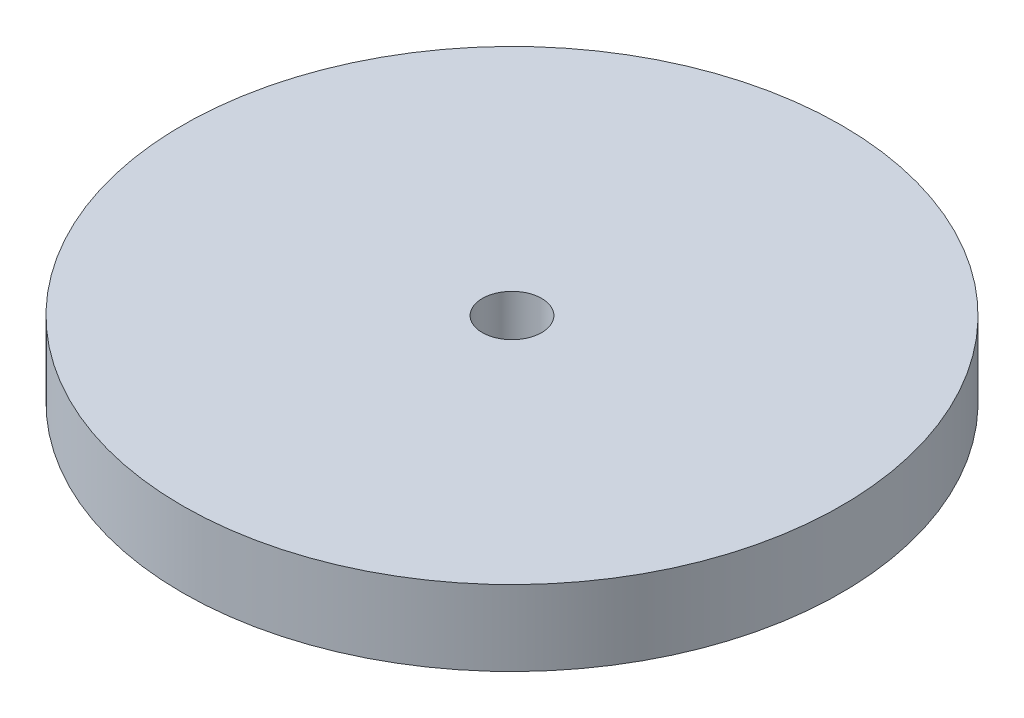
ISO-10303-21;
HEADER;
FILE_DESCRIPTION(('STEP AP214'),'2;1');
FILE_NAME('part.step','',(''),(''),'','','');
FILE_SCHEMA(('AUTOMOTIVE_DESIGN { 1 0 10303 214 1 1 1 1 }'));
ENDSEC;
DATA;
#1=APPLICATION_CONTEXT('core data for automotive mechanical design processes');
#2=APPLICATION_PROTOCOL_DEFINITION('international standard','automotive_design',2000,#1);
#3=PRODUCT_CONTEXT('',#1,'mechanical');
#4=PRODUCT('Part','Part','',(#3));
#5=PRODUCT_RELATED_PRODUCT_CATEGORY('part','',(#4));
#6=PRODUCT_DEFINITION_FORMATION('','',#4);
#7=PRODUCT_DEFINITION_CONTEXT('part definition',#1,'design');
#8=PRODUCT_DEFINITION('design','',#6,#7);
#9=PRODUCT_DEFINITION_SHAPE('','',#8);
#10=(LENGTH_UNIT() NAMED_UNIT(*) SI_UNIT(.MILLI.,.METRE.));
#11=(NAMED_UNIT(*) PLANE_ANGLE_UNIT() SI_UNIT($,.RADIAN.));
#12=(NAMED_UNIT(*) SI_UNIT($,.STERADIAN.) SOLID_ANGLE_UNIT());
#13=UNCERTAINTY_MEASURE_WITH_UNIT(LENGTH_MEASURE(1.E-05),#10,'distance_accuracy_value','');
#14=(GEOMETRIC_REPRESENTATION_CONTEXT(3) GLOBAL_UNCERTAINTY_ASSIGNED_CONTEXT((#13)) GLOBAL_UNIT_ASSIGNED_CONTEXT((#10,
#11,#12)) REPRESENTATION_CONTEXT('',''));
#15=CARTESIAN_POINT('',(0.,0.,0.));
#16=DIRECTION('',(0.,0.,1.));
#17=DIRECTION('',(1.,0.,0.));
#18=AXIS2_PLACEMENT_3D('',#15,#16,#17);
#19=CARTESIAN_POINT('',(0.,7.62,0.));
#20=DIRECTION('',(0.,-1.,0.));
#21=DIRECTION('',(0.,0.,-1.));
#22=AXIS2_PLACEMENT_3D('',#19,#20,#21);
#23=CYLINDRICAL_SURFACE('',#22,33.3375);
#24=CARTESIAN_POINT('',(0.,7.62,0.));
#25=DIRECTION('',(0.,1.,0.));
#26=DIRECTION('',(0.,0.,1.));
#27=AXIS2_PLACEMENT_3D('',#24,#25,#26);
#28=CIRCLE('',#27,33.3375);
#29=CARTESIAN_POINT('',(0.,7.62,-33.3375));
#30=VERTEX_POINT('',#29);
#31=EDGE_CURVE('E10',#30,#30,#28,.T.);
#32=CARTESIAN_POINT('',(0.,0.,0.));
#33=DIRECTION('',(0.,1.,0.));
#34=DIRECTION('',(0.,0.,1.));
#35=AXIS2_PLACEMENT_3D('',#32,#33,#34);
#36=CIRCLE('',#35,33.3375);
#37=CARTESIAN_POINT('',(0.,0.,-33.3375));
#38=VERTEX_POINT('',#37);
#39=EDGE_CURVE('E36',#38,#38,#36,.T.);
#40=CARTESIAN_POINT('',(0.,7.62,-33.3375));
#41=CARTESIAN_POINT('',(0.,7.540625,-33.3375));
#42=CARTESIAN_POINT('',(0.,7.46125,-33.3375));
#43=CARTESIAN_POINT('',(0.,7.3025,-33.3375));
#44=CARTESIAN_POINT('',(0.,7.223125,-33.3375));
#45=CARTESIAN_POINT('',(0.,7.064375,-33.3375));
#46=CARTESIAN_POINT('',(0.,6.985,-33.3375));
#47=CARTESIAN_POINT('',(0.,6.82625,-33.3375));
#48=CARTESIAN_POINT('',(0.,6.746875,-33.3375));
#49=CARTESIAN_POINT('',(0.,6.588125,-33.3375));
#50=CARTESIAN_POINT('',(0.,6.50875,-33.3375));
#51=CARTESIAN_POINT('',(0.,6.35,-33.3375));
#52=CARTESIAN_POINT('',(0.,6.270625,-33.3375));
#53=CARTESIAN_POINT('',(0.,6.111875,-33.3375));
#54=CARTESIAN_POINT('',(0.,6.0325,-33.3375));
#55=CARTESIAN_POINT('',(0.,5.87375,-33.3375));
#56=CARTESIAN_POINT('',(0.,5.794375,-33.3375));
#57=CARTESIAN_POINT('',(0.,5.635625,-33.3375));
#58=CARTESIAN_POINT('',(0.,5.55625,-33.3375));
#59=CARTESIAN_POINT('',(0.,5.3975,-33.3375));
#60=CARTESIAN_POINT('',(0.,5.318125,-33.3375));
#61=CARTESIAN_POINT('',(0.,5.159375,-33.3375));
#62=CARTESIAN_POINT('',(0.,5.08,-33.3375));
#63=CARTESIAN_POINT('',(0.,4.92125,-33.3375));
#64=CARTESIAN_POINT('',(0.,4.841875,-33.3375));
#65=CARTESIAN_POINT('',(0.,4.683125,-33.3375));
#66=CARTESIAN_POINT('',(0.,4.60375,-33.3375));
#67=CARTESIAN_POINT('',(0.,4.445,-33.3375));
#68=CARTESIAN_POINT('',(0.,4.365625,-33.3375));
#69=CARTESIAN_POINT('',(0.,4.206875,-33.3375));
#70=CARTESIAN_POINT('',(0.,4.1275,-33.3375));
#71=CARTESIAN_POINT('',(0.,3.96875,-33.3375));
#72=CARTESIAN_POINT('',(0.,3.889375,-33.3375));
#73=CARTESIAN_POINT('',(0.,3.730625,-33.3375));
#74=CARTESIAN_POINT('',(0.,3.65125,-33.3375));
#75=CARTESIAN_POINT('',(0.,3.4925,-33.3375));
#76=CARTESIAN_POINT('',(0.,3.413125,-33.3375));
#77=CARTESIAN_POINT('',(0.,3.254375,-33.3375));
#78=CARTESIAN_POINT('',(0.,3.175,-33.3375));
#79=CARTESIAN_POINT('',(0.,3.01625,-33.3375));
#80=CARTESIAN_POINT('',(0.,2.936875,-33.3375));
#81=CARTESIAN_POINT('',(0.,2.778125,-33.3375));
#82=CARTESIAN_POINT('',(0.,2.69875,-33.3375));
#83=CARTESIAN_POINT('',(0.,2.54,-33.3375));
#84=CARTESIAN_POINT('',(0.,2.460625,-33.3375));
#85=CARTESIAN_POINT('',(0.,2.301875,-33.3375));
#86=CARTESIAN_POINT('',(0.,2.2225,-33.3375));
#87=CARTESIAN_POINT('',(0.,2.06375,-33.3375));
#88=CARTESIAN_POINT('',(0.,1.984375,-33.3375));
#89=CARTESIAN_POINT('',(0.,1.825625,-33.3375));
#90=CARTESIAN_POINT('',(0.,1.74625,-33.3375));
#91=CARTESIAN_POINT('',(0.,1.5875,-33.3375));
#92=CARTESIAN_POINT('',(0.,1.508125,-33.3375));
#93=CARTESIAN_POINT('',(0.,1.349375,-33.3375));
#94=CARTESIAN_POINT('',(0.,1.27,-33.3375));
#95=CARTESIAN_POINT('',(0.,1.11125,-33.3375));
#96=CARTESIAN_POINT('',(0.,1.031875,-33.3375));
#97=CARTESIAN_POINT('',(0.,0.873125,-33.3375));
#98=CARTESIAN_POINT('',(0.,0.79375,-33.3375));
#99=CARTESIAN_POINT('',(0.,0.635,-33.3375));
#100=CARTESIAN_POINT('',(0.,0.555625,-33.3375));
#101=CARTESIAN_POINT('',(0.,0.396875,-33.3375));
#102=CARTESIAN_POINT('',(0.,0.3175,-33.3375));
#103=CARTESIAN_POINT('',(0.,0.15875,-33.3375));
#104=CARTESIAN_POINT('',(0.,0.0793749999999999,-33.3375));
#105=CARTESIAN_POINT('',(0.,0.,-33.3375));
#106=B_SPLINE_CURVE_WITH_KNOTS('',3,(#40,#41,#42,#43,#44,#45,#46,#47,#48,#49,#50,#51,#52,#53,
#54,#55,#56,#57,#58,#59,#60,#61,#62,#63,#64,#65,#66,#67,#68,#69,#70,#71,#72,#73,#74,#75,#76,#77,
#78,#79,#80,#81,#82,#83,#84,#85,#86,#87,#88,#89,#90,#91,#92,#93,#94,#95,#96,#97,#98,#99,#100,
#101,#102,#103,#104,#105),.UNSPECIFIED.,.F.,.F.,(4,2,2,2,2,2,2,2,2,2,2,2,2,2,2,2,2,2,2,2,2,2,2,
2,2,2,2,2,2,2,2,2,4),(0.,0.238125,0.476249999999999,0.714375,0.952499999999999,1.190625,1.42875,
1.666875,1.905,2.143125,2.38125,2.619375,2.8575,3.095625,3.33375,3.571875,3.81,4.048125,4.28625,
4.524375,4.7625,5.000625,5.23875,5.476875,5.715,5.953125,6.19125,6.429375,6.6675,6.905625,
7.14375,7.381875,7.62),.UNSPECIFIED.);
#107=EDGE_CURVE('BSEAM33',#30,#38,#106,.T.);
#108=ORIENTED_EDGE('',*,*,#31,.F.);
#109=ORIENTED_EDGE('',*,*,#39,.T.);
#110=ORIENTED_EDGE('',*,*,#107,.T.);
#111=ORIENTED_EDGE('',*,*,#107,.F.);
#112=EDGE_LOOP('',(#108,#110,#109,#111));
#113=FACE_BOUND('',#112,.T.);
#114=ADVANCED_FACE('F33',(#113),#23,.T.);
#115=CARTESIAN_POINT('',(0.,7.62,0.));
#116=DIRECTION('',(0.,1.,0.));
#117=DIRECTION('',(0.,0.,1.));
#118=AXIS2_PLACEMENT_3D('',#115,#116,#117);
#119=PLANE('',#118);
#120=CARTESIAN_POINT('',(0.,7.62,0.));
#121=DIRECTION('',(0.,1.,0.));
#122=DIRECTION('',(0.,0.,1.));
#123=AXIS2_PLACEMENT_3D('',#120,#121,#122);
#124=CIRCLE('',#123,3.);
#125=CARTESIAN_POINT('',(0.,7.62,3.));
#126=VERTEX_POINT('',#125);
#127=EDGE_CURVE('E47',#126,#126,#124,.T.);
#128=ORIENTED_EDGE('',*,*,#127,.F.);
#129=EDGE_LOOP('',(#128));
#130=FACE_BOUND('',#129,.T.);
#131=ORIENTED_EDGE('',*,*,#31,.T.);
#132=EDGE_LOOP('',(#131));
#133=FACE_BOUND('',#132,.T.);
#134=ADVANCED_FACE('F54',(#130,#133),#119,.T.);
#135=CARTESIAN_POINT('',(0.,0.,0.));
#136=DIRECTION('',(0.,1.,0.));
#137=DIRECTION('',(0.,0.,1.));
#138=AXIS2_PLACEMENT_3D('',#135,#136,#137);
#139=PLANE('',#138);
#140=CARTESIAN_POINT('',(0.,0.,0.));
#141=DIRECTION('',(0.,1.,0.));
#142=DIRECTION('',(0.,0.,1.));
#143=AXIS2_PLACEMENT_3D('',#140,#141,#142);
#144=CIRCLE('',#143,3.);
#145=CARTESIAN_POINT('',(0.,0.,3.));
#146=VERTEX_POINT('',#145);
#147=EDGE_CURVE('E43',#146,#146,#144,.F.);
#148=ORIENTED_EDGE('',*,*,#147,.F.);
#149=EDGE_LOOP('',(#148));
#150=FACE_BOUND('',#149,.T.);
#151=ORIENTED_EDGE('',*,*,#39,.F.);
#152=EDGE_LOOP('',(#151));
#153=FACE_BOUND('',#152,.T.);
#154=ADVANCED_FACE('F56',(#150,#153),#139,.F.);
#155=CARTESIAN_POINT('',(0.,-0.00100000000000013,0.));
#156=DIRECTION('',(0.,1.,0.));
#157=DIRECTION('',(0.,0.,1.));
#158=AXIS2_PLACEMENT_3D('',#155,#156,#157);
#159=CYLINDRICAL_SURFACE('',#158,3.);
#160=ORIENTED_EDGE('',*,*,#127,.T.);
#161=EDGE_LOOP('',(#160));
#162=FACE_BOUND('',#161,.T.);
#163=ORIENTED_EDGE('',*,*,#147,.T.);
#164=EDGE_LOOP('',(#163));
#165=FACE_BOUND('',#164,.T.);
#166=ADVANCED_FACE('F51',(#162,#165),#159,.F.);
#167=CLOSED_SHELL('',(#114,#134,#154,#166));
#168=MANIFOLD_SOLID_BREP('B2',#167);
#169=ADVANCED_BREP_SHAPE_REPRESENTATION('',(#18,#168),#14);
#170=SHAPE_DEFINITION_REPRESENTATION(#9,#169);
ENDSEC;
END-ISO-10303-21;
